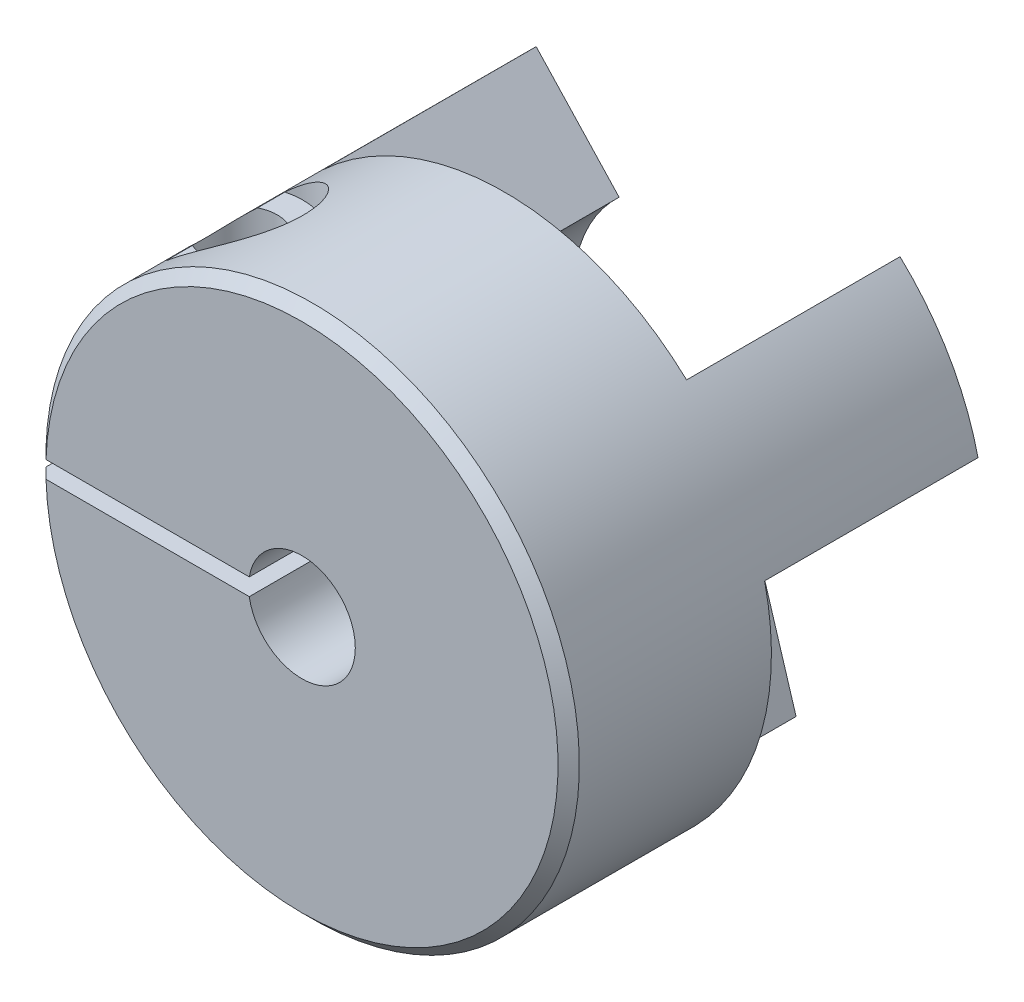
ISO-10303-21;
HEADER;
FILE_DESCRIPTION(('STEP AP214'),'2;1');
FILE_NAME('part.step','',(''),(''),'','','');
FILE_SCHEMA(('AUTOMOTIVE_DESIGN { 1 0 10303 214 1 1 1 1 }'));
ENDSEC;
DATA;
#1=APPLICATION_CONTEXT('core data for automotive mechanical design processes');
#2=APPLICATION_PROTOCOL_DEFINITION('international standard','automotive_design',2000,#1);
#3=PRODUCT_CONTEXT('',#1,'mechanical');
#4=PRODUCT('Part','Part','',(#3));
#5=PRODUCT_RELATED_PRODUCT_CATEGORY('part','',(#4));
#6=PRODUCT_DEFINITION_FORMATION('','',#4);
#7=PRODUCT_DEFINITION_CONTEXT('part definition',#1,'design');
#8=PRODUCT_DEFINITION('design','',#6,#7);
#9=PRODUCT_DEFINITION_SHAPE('','',#8);
#10=(LENGTH_UNIT() NAMED_UNIT(*) SI_UNIT(.MILLI.,.METRE.));
#11=(NAMED_UNIT(*) PLANE_ANGLE_UNIT() SI_UNIT($,.RADIAN.));
#12=(NAMED_UNIT(*) SI_UNIT($,.STERADIAN.) SOLID_ANGLE_UNIT());
#13=UNCERTAINTY_MEASURE_WITH_UNIT(LENGTH_MEASURE(1.E-05),#10,'distance_accuracy_value','');
#14=(GEOMETRIC_REPRESENTATION_CONTEXT(3) GLOBAL_UNCERTAINTY_ASSIGNED_CONTEXT((#13)) GLOBAL_UNIT_ASSIGNED_CONTEXT((#10,
#11,#12)) REPRESENTATION_CONTEXT('',''));
#15=CARTESIAN_POINT('',(0.,0.,0.));
#16=DIRECTION('',(0.,0.,1.));
#17=DIRECTION('',(1.,0.,0.));
#18=AXIS2_PLACEMENT_3D('',#15,#16,#17);
#19=CARTESIAN_POINT('',(0.,0.,30.));
#20=DIRECTION('',(0.,0.,-1.));
#21=DIRECTION('',(-1.,0.,0.));
#22=AXIS2_PLACEMENT_3D('',#19,#20,#21);
#23=CYLINDRICAL_SURFACE('',#22,12.5);
#24=CARTESIAN_POINT('',(-7.6,-9.92421281513048,26.5));
#25=CARTESIAN_POINT('',(-7.68387893240252,-9.85997501388689,26.4999990668987));
#26=CARTESIAN_POINT('',(-7.76703857513674,-9.79458974366175,26.4915589530429));
#27=CARTESIAN_POINT('',(-7.92994925789858,-9.66317408930223,26.4585437537323));
#28=CARTESIAN_POINT('',(-8.00968671612452,-9.59714222024347,26.4339097579805));
#29=CARTESIAN_POINT('',(-8.1691972059026,-9.46181273338649,26.3664863933876));
#30=CARTESIAN_POINT('',(-8.2485698895975,-9.39261661070717,26.3225309830227));
#31=CARTESIAN_POINT('',(-8.39834638585054,-9.25892967544829,26.2162022999162));
#32=CARTESIAN_POINT('',(-8.46877481949099,-9.19442616439073,26.1538812276331));
#33=CARTESIAN_POINT('',(-8.57222927758574,-9.09779263904373,26.0378881768289));
#34=CARTESIAN_POINT('',(-8.60921173738582,-9.06276421607423,25.990133738076));
#35=CARTESIAN_POINT('',(-8.67706529521363,-8.99781790078996,25.8873451831582));
#36=CARTESIAN_POINT('',(-8.70794626351018,-8.9678917655327,25.8323230684441));
#37=CARTESIAN_POINT('',(-8.75671836935872,-8.9202478067014,25.726661162025));
#38=CARTESIAN_POINT('',(-8.77596550900409,-8.90128896328587,25.6772135383242));
#39=CARTESIAN_POINT('',(-8.80833596594029,-8.86925806359337,25.5745221109184));
#40=CARTESIAN_POINT('',(-8.8214635914766,-8.85618186605753,25.5212810084248));
#41=CARTESIAN_POINT('',(-8.84072211978142,-8.83695793454696,25.411895186045));
#42=CARTESIAN_POINT('',(-8.84680333239945,-8.83085940971742,25.3557327286654));
#43=CARTESIAN_POINT('',(-8.85125405531002,-8.82639872111681,25.2428030069807));
#44=CARTESIAN_POINT('',(-8.84962689745147,-8.8280332148426,25.1860360145629));
#45=CARTESIAN_POINT('',(-8.83943558165185,-8.83823609156327,25.0802847985366));
#46=CARTESIAN_POINT('',(-8.83166855849576,-8.84600759611886,25.0311408411908));
#47=CARTESIAN_POINT('',(-8.81071211495501,-8.86688048496426,24.9352144751942));
#48=CARTESIAN_POINT('',(-8.79752056447862,-8.8799839629808,24.8884330023505));
#49=CARTESIAN_POINT('',(-8.76155296266749,-8.91549242952821,24.7839233398334));
#50=CARTESIAN_POINT('',(-8.73707041699478,-8.93952415080396,24.7273370269448));
#51=CARTESIAN_POINT('',(-8.68159285234098,-8.99341118960891,24.6204766352985));
#52=CARTESIAN_POINT('',(-8.65058500164624,-9.02327797310853,24.5702153102265));
#53=CARTESIAN_POINT('',(-8.57172361060947,-9.09832059660089,24.4598620356182));
#54=CARTESIAN_POINT('',(-8.52176454833326,-9.14520514731759,24.402444378267));
#55=CARTESIAN_POINT('',(-8.41494840468984,-9.24358911413135,24.2992708445779));
#56=CARTESIAN_POINT('',(-8.35808445202518,-9.29509311366319,24.2535267276955));
#57=CARTESIAN_POINT('',(-8.23759752658586,-9.40205489200958,24.1723288992536));
#58=CARTESIAN_POINT('',(-8.17383965010894,-9.45757983770614,24.1371657861184));
#59=CARTESIAN_POINT('',(-8.04214562035359,-9.56981677126619,24.0785894960378));
#60=CARTESIAN_POINT('',(-7.97420872623943,-9.62652896841746,24.0551784092115));
#61=CARTESIAN_POINT('',(-7.82030510738814,-9.75216283659322,24.0164905871854));
#62=CARTESIAN_POINT('',(-7.73360727189793,-9.82108266942204,24.0040529057531));
#63=CARTESIAN_POINT('',(-7.55791038521023,-9.95692248131038,23.9976227510883));
#64=CARTESIAN_POINT('',(-7.4689113367745,-10.0238424627698,24.00363025572));
#65=CARTESIAN_POINT('',(-7.30602525112332,-10.1430007304761,24.0327262090234));
#66=CARTESIAN_POINT('',(-7.23205410468351,-10.1958466549922,24.0528510715271));
#67=CARTESIAN_POINT('',(-7.08670423561914,-10.2974000295699,24.1076162450596));
#68=CARTESIAN_POINT('',(-7.01532213947848,-10.3461129845503,24.1422368714474));
#69=CARTESIAN_POINT('',(-6.88932801153551,-10.4303372039459,24.2194821232642));
#70=CARTESIAN_POINT('',(-6.83389513325901,-10.4666993327386,24.2598354504168));
#71=CARTESIAN_POINT('',(-6.72880105556181,-10.5345690120851,24.3509223120323));
#72=CARTESIAN_POINT('',(-6.67913893435736,-10.5660773382168,24.4016541851091));
#73=CARTESIAN_POINT('',(-6.58758134943983,-10.6234043259133,24.5132812183037));
#74=CARTESIAN_POINT('',(-6.54574469359811,-10.6491801614728,24.5742472725999));
#75=CARTESIAN_POINT('',(-6.47278621450771,-10.6936840567788,24.7046087444252));
#76=CARTESIAN_POINT('',(-6.44165534454685,-10.7124180683306,24.7739969775336));
#77=CARTESIAN_POINT('',(-6.39551565087219,-10.7400189546131,24.9092174403513));
#78=CARTESIAN_POINT('',(-6.37892219609344,-10.7498612132183,24.9743120097952));
#79=CARTESIAN_POINT('',(-6.35639684850603,-10.7631964230495,25.1069424832717));
#80=CARTESIAN_POINT('',(-6.35045806726809,-10.766693476576,25.1744767811419));
#81=CARTESIAN_POINT('',(-6.34963134292491,-10.7671805366923,25.303557625438));
#82=CARTESIAN_POINT('',(-6.35380145736474,-10.7647251846686,25.3650988256944));
#83=CARTESIAN_POINT('',(-6.3710407633935,-10.7545310867164,25.486460512705));
#84=CARTESIAN_POINT('',(-6.38410862181534,-10.7467931322904,25.5462812558397));
#85=CARTESIAN_POINT('',(-6.41837800448828,-10.7263607177177,25.662188754854));
#86=CARTESIAN_POINT('',(-6.43952488060037,-10.7136995491784,25.7182976897356));
#87=CARTESIAN_POINT('',(-6.4890014412295,-10.6838051452944,25.8259280188613));
#88=CARTESIAN_POINT('',(-6.51733264849404,-10.6665709406405,25.8774484374191));
#89=CARTESIAN_POINT('',(-6.58210298326866,-10.6267329662093,25.9781487610848));
#90=CARTESIAN_POINT('',(-6.61895182448738,-10.6038512924259,26.0269539280707));
#91=CARTESIAN_POINT('',(-6.69808250767865,-10.5540454980953,26.1175643286869));
#92=CARTESIAN_POINT('',(-6.74036604265006,-10.527120117423,26.1593673716514));
#93=CARTESIAN_POINT('',(-6.83446922820905,-10.4663047527811,26.2403408484846));
#94=CARTESIAN_POINT('',(-6.88682190212647,-10.4319653960025,26.2785519148117));
#95=CARTESIAN_POINT('',(-6.99496672289602,-10.3597623961685,26.3456700091722));
#96=CARTESIAN_POINT('',(-7.05076203916674,-10.3218954886719,26.3745683065464));
#97=CARTESIAN_POINT('',(-7.17368153568159,-10.2369306446989,26.4272556186633));
#98=CARTESIAN_POINT('',(-7.24115822111427,-10.1893394698823,26.4494195481482));
#99=CARTESIAN_POINT('',(-7.37688803993087,-10.0915067533404,26.4819031068614));
#100=CARTESIAN_POINT('',(-7.44514019786839,-10.0412683026013,26.4922362427807));
#101=CARTESIAN_POINT('',(-7.54210522411499,-9.96834924724743,26.498998497446));
#102=CARTESIAN_POINT('',(-7.57109531958037,-9.94634916167928,26.5000003215467));
#103=CARTESIAN_POINT('',(-7.6,-9.92421281513048,26.5));
#104=B_SPLINE_CURVE_WITH_KNOTS('',3,(#24,#25,#26,#27,#28,#29,#30,#31,#32,#33,#34,#35,#36,#37,
#38,#39,#40,#41,#42,#43,#44,#45,#46,#47,#48,#49,#50,#51,#52,#53,#54,#55,#56,#57,#58,#59,#60,#61,
#62,#63,#64,#65,#66,#67,#68,#69,#70,#71,#72,#73,#74,#75,#76,#77,#78,#79,#80,#81,#82,#83,#84,#85,
#86,#87,#88,#89,#90,#91,#92,#93,#94,#95,#96,#97,#98,#99,#100,#101,#102,#103),.UNSPECIFIED.,.T.,
.F.,(4,2,2,2,2,2,2,2,2,2,2,2,2,2,2,2,2,2,2,2,2,2,2,2,2,2,2,2,2,2,2,2,2,2,2,2,2,2,2,4),(0.,
0.316865241311505,0.634889605397307,0.975519522756832,1.31519045989525,1.52400263789751,
1.73247420778647,1.90085408598353,2.06911524208715,2.23855586275837,2.40792325147661,
2.55832660266192,2.70878907039603,2.9062234974507,3.10404986018343,3.37078662412628,
3.637791036622,3.91157121918875,4.18540007682069,4.51822228774219,4.85104409924995,
5.12927031980454,5.40711993990698,5.63900873717533,5.87086044294774,6.10439004745895,
6.33772182468545,6.5402849302682,6.74271702806967,6.92702205736014,7.11129947792808,
7.294351866951,7.47744308713101,7.67253481749374,7.8676874701945,8.08689097869655,
8.30629939521027,8.56183970699069,8.81708798794211,8.92627975128317),.UNSPECIFIED.);
#105=CARTESIAN_POINT('',(-7.6,-9.92421281513048,26.5));
#106=VERTEX_POINT('',#105);
#107=EDGE_CURVE('E236',#106,#106,#104,.T.);
#108=ORIENTED_EDGE('',*,*,#107,.F.);
#109=EDGE_LOOP('',(#108));
#110=FACE_BOUND('',#109,.T.);
#111=CARTESIAN_POINT('',(-8.35224520712844,9.3,23.7254911780012));
#112=CARTESIAN_POINT('',(-8.40226193404916,9.25508729611474,23.7501859675804));
#113=CARTESIAN_POINT('',(-8.4512364555864,9.21036807082561,23.7773995701309));
#114=CARTESIAN_POINT('',(-8.54687845049452,9.12168281106277,23.8369838824607));
#115=CARTESIAN_POINT('',(-8.59354117082,9.07771844065415,23.8693646826729));
#116=CARTESIAN_POINT('',(-8.68467769234288,8.99057294568326,23.9397234366466));
#117=CARTESIAN_POINT('',(-8.72911868921365,8.94740744980079,23.9777636277927));
#118=CARTESIAN_POINT('',(-8.81473334070862,8.86307418206008,24.0592386730297));
#119=CARTESIAN_POINT('',(-8.85590993986654,8.8219046231677,24.1026685726654));
#120=CARTESIAN_POINT('',(-8.94579144857408,8.73086376515911,24.2083922940015));
#121=CARTESIAN_POINT('',(-8.99327100113298,8.68188088533853,24.272524924123));
#122=CARTESIAN_POINT('',(-9.08026131183957,8.59085571876297,24.4101109852827));
#123=CARTESIAN_POINT('',(-9.11980294161462,8.54878666381892,24.4835264228847));
#124=CARTESIAN_POINT('',(-9.18170707878571,8.48220967442307,24.6232926843491));
#125=CARTESIAN_POINT('',(-9.20593227999762,8.45586909085604,24.6879313099214));
#126=CARTESIAN_POINT('',(-9.24679495439347,8.41116555145942,24.8222376178885));
#127=CARTESIAN_POINT('',(-9.2634362704352,8.39279855552864,24.8919027325171));
#128=CARTESIAN_POINT('',(-9.28795731971447,8.36565591053207,25.0352437135378));
#129=CARTESIAN_POINT('',(-9.29576480665469,8.35695935970522,25.1089475555037));
#130=CARTESIAN_POINT('',(-9.30159980379011,8.35046502407868,25.2572103254579));
#131=CARTESIAN_POINT('',(-9.29963247784537,8.35266148469334,25.3317687812023));
#132=CARTESIAN_POINT('',(-9.28700971237624,8.36669071447892,25.4694607688084));
#133=CARTESIAN_POINT('',(-9.27749463970581,8.37725842575372,25.5328383996841));
#134=CARTESIAN_POINT('',(-9.25187706516665,8.40554182397002,25.6565700820806));
#135=CARTESIAN_POINT('',(-9.23577188613165,8.42326041584669,25.7169228936003));
#136=CARTESIAN_POINT('',(-9.19103679871523,8.47208852541456,25.8546138617646));
#137=CARTESIAN_POINT('',(-9.15998597138285,8.50572192948052,25.930266124301));
#138=CARTESIAN_POINT('',(-9.08951065341228,8.58099434314065,26.0732532355516));
#139=CARTESIAN_POINT('',(-9.05006654390278,8.62265208722077,26.1405680022186));
#140=CARTESIAN_POINT('',(-8.9472728065756,8.72947666786682,26.2922655802687));
#141=CARTESIAN_POINT('',(-8.88070472255737,8.79734010286694,26.3725501817322));
#142=CARTESIAN_POINT('',(-8.73779282300051,8.93930400730743,26.5171924062114));
#143=CARTESIAN_POINT('',(-8.66144048840268,9.01340989249439,26.5815360046045));
#144=CARTESIAN_POINT('',(-8.54454616953303,9.1237768200878,26.6641613940842));
#145=CARTESIAN_POINT('',(-8.50699903790586,9.15880320147978,26.6885197100563));
#146=CARTESIAN_POINT('',(-8.43060123949417,9.2291737642549,26.7339356510727));
#147=CARTESIAN_POINT('',(-8.39175696958336,9.26451589430551,26.7550072035281));
#148=CARTESIAN_POINT('',(-8.35224520712907,9.29999999999944,26.7745088220005));
#149=B_SPLINE_CURVE_WITH_KNOTS('',3,(#111,#112,#113,#114,#115,#116,#117,#118,#119,#120,#121,
#122,#123,#124,#125,#126,#127,#128,#129,#130,#131,#132,#133,#134,#135,#136,#137,#138,#139,#140,
#141,#142,#143,#144,#145,#146,#147,#148),.UNSPECIFIED.,.F.,.F.,(4,2,2,2,2,2,2,2,2,2,2,2,2,2,2,2,
2,2,4),(0.,0.214819906168286,0.430064562217868,0.647880296760304,0.86549726843017,
1.14549332214258,1.42437838773678,1.64519134608746,1.86589229076014,2.08838544952107,
2.31076108159869,2.50476806710598,2.69885394442305,2.96265569184933,3.22708097229084,
3.59838260309518,3.97000974788138,4.14041701421656,4.31008133574808),.UNSPECIFIED.);
#150=CARTESIAN_POINT('',(-8.35224520712844,9.3,23.7254911780011));
#151=VERTEX_POINT('',#150);
#152=CARTESIAN_POINT('',(-8.35224520712844,9.3,26.7745088219989));
#153=VERTEX_POINT('',#152);
#154=EDGE_CURVE('E193',#151,#153,#149,.T.);
#155=ORIENTED_EDGE('',*,*,#154,.F.);
#156=DIRECTION('',(0.,0.,-1.));
#157=VECTOR('',#156,1.);
#158=CARTESIAN_POINT('',(-8.35224520712844,9.3,30.));
#159=LINE('',#158,#157);
#160=CARTESIAN_POINT('',(-8.35224520712844,9.3,22.4492631061893));
#161=VERTEX_POINT('',#160);
#162=EDGE_CURVE('E176',#161,#151,#159,.F.);
#163=ORIENTED_EDGE('',*,*,#162,.F.);
#164=CARTESIAN_POINT('',(-8.35224520712844,9.3,28.0507368938107));
#165=CARTESIAN_POINT('',(-8.26293950720659,9.38022098917911,28.0747136471542));
#166=CARTESIAN_POINT('',(-8.17182825992512,9.45970676843527,28.0946133193194));
#167=CARTESIAN_POINT('',(-7.98635106699914,9.61680341182153,28.1256919557303));
#168=CARTESIAN_POINT('',(-7.89198098158537,9.69441166096315,28.1368593672165));
#169=CARTESIAN_POINT('',(-7.69997510730801,9.84761755883427,28.149881570101));
#170=CARTESIAN_POINT('',(-7.60232242673459,9.92319936917805,28.1516769600697));
#171=CARTESIAN_POINT('',(-7.4051000657056,10.071231608398,28.145125081026));
#172=CARTESIAN_POINT('',(-7.30553147667928,10.1436837480198,28.1367834276922));
#173=CARTESIAN_POINT('',(-7.04511871236953,10.3273724804234,28.1010100047947));
#174=CARTESIAN_POINT('',(-6.88334106018227,10.4358075798013,28.0651291613088));
#175=CARTESIAN_POINT('',(-6.56206180609799,10.6407467476791,27.9631064915147));
#176=CARTESIAN_POINT('',(-6.40255564706173,10.7372790277478,27.8970380362465));
#177=CARTESIAN_POINT('',(-6.16914680392402,10.8719776066146,27.7739899126952));
#178=CARTESIAN_POINT('',(-6.09195929284978,10.9153792104769,27.7287043103893));
#179=CARTESIAN_POINT('',(-5.94074821983299,10.9984052628958,27.6301287094269));
#180=CARTESIAN_POINT('',(-5.86672309111758,11.0380315941332,27.5768427349698));
#181=CARTESIAN_POINT('',(-5.72282615105309,11.113319343656,27.4623912673127));
#182=CARTESIAN_POINT('',(-5.65295538959969,11.1489797616374,27.4012237945584));
#183=CARTESIAN_POINT('',(-5.51843665048896,11.2161716997034,27.2713435095178));
#184=CARTESIAN_POINT('',(-5.45378779662154,11.2477039130337,27.2026319676728));
#185=CARTESIAN_POINT('',(-5.33890274715841,11.3026377939579,27.0677500663984));
#186=CARTESIAN_POINT('',(-5.28789206320964,11.3265631549328,27.0024504532011));
#187=CARTESIAN_POINT('',(-5.19118617234646,11.3712102894973,26.8669556806136));
#188=CARTESIAN_POINT('',(-5.1454928203844,11.3919309459497,26.7967588263979));
#189=CARTESIAN_POINT('',(-5.06007099171543,11.4301300337332,26.6520726673792));
#190=CARTESIAN_POINT('',(-5.02033701900852,11.4476114559757,26.5775874063822));
#191=CARTESIAN_POINT('',(-4.94729161650502,11.479367834436,26.4248693692089));
#192=CARTESIAN_POINT('',(-4.91398239760068,11.4936416871399,26.3466353145151));
#193=CARTESIAN_POINT('',(-4.82973798584549,11.5294048576894,26.1215705682794));
#194=CARTESIAN_POINT('',(-4.78673048223669,11.5472201781899,25.9710691877698));
#195=CARTESIAN_POINT('',(-4.7254939120127,11.5724162187856,25.6643640526813));
#196=CARTESIAN_POINT('',(-4.70725886329544,11.579799458058,25.5081616841476));
#197=CARTESIAN_POINT('',(-4.69646410379634,11.584181089387,25.1996787237852));
#198=CARTESIAN_POINT('',(-4.70311006258827,11.5815007547541,25.0474304724457));
#199=CARTESIAN_POINT('',(-4.74004751066886,11.5664316602643,24.7463363694815));
#200=CARTESIAN_POINT('',(-4.77033723588752,11.5540436247022,24.5974902648742));
#201=CARTESIAN_POINT('',(-4.85318126093607,11.5194886557954,24.3078767692581));
#202=CARTESIAN_POINT('',(-4.9056613324079,11.4973543144486,24.1670842051032));
#203=CARTESIAN_POINT('',(-5.03073999476451,11.4431759480608,23.8968269189766));
#204=CARTESIAN_POINT('',(-5.10333839448021,11.4111320171827,23.7673620893815));
#205=CARTESIAN_POINT('',(-5.26729102301348,11.3363963570979,23.5206000125109));
#206=CARTESIAN_POINT('',(-5.35897435706196,11.2935145050267,23.4035795681062));
#207=CARTESIAN_POINT('',(-5.55655600955504,11.1976214564941,23.1870317367122));
#208=CARTESIAN_POINT('',(-5.66245753734436,11.1446079719631,23.0875083109148));
#209=CARTESIAN_POINT('',(-5.89061287109652,11.0257913673905,22.9025066283258));
#210=CARTESIAN_POINT('',(-6.01344333789608,10.9594486526414,22.8180895239203));
#211=CARTESIAN_POINT('',(-6.26606232950751,10.8170005662463,22.6708514205152));
#212=CARTESIAN_POINT('',(-6.39585110593982,10.7408948414201,22.6080312030934));
#213=CARTESIAN_POINT('',(-6.67276520912226,10.5713444274491,22.4977644186962));
#214=CARTESIAN_POINT('',(-6.82024115776802,10.4769142114719,22.4527320778459));
#215=CARTESIAN_POINT('',(-7.11489576532022,10.2790959802123,22.3868685073896));
#216=CARTESIAN_POINT('',(-7.2620733494475,10.1756915122637,22.3660827813864));
#217=CARTESIAN_POINT('',(-7.48965300002123,10.0082768290894,22.3509239202925));
#218=CARTESIAN_POINT('',(-7.57137554044642,9.94659539778096,22.3490113465646));
#219=CARTESIAN_POINT('',(-7.73323519825306,9.82127980746248,22.3519321273997));
#220=CARTESIAN_POINT('',(-7.81337190419432,9.75764515234132,22.3567672099416));
#221=CARTESIAN_POINT('',(-7.9713003078811,9.62905449971884,22.3727771327598));
#222=CARTESIAN_POINT('',(-8.04910108071308,9.56410590763545,22.3839227723684));
#223=CARTESIAN_POINT('',(-8.20242836637512,9.43294098359872,22.4121938275297));
#224=CARTESIAN_POINT('',(-8.27795637252234,9.36672553298877,22.4293152192307));
#225=CARTESIAN_POINT('',(-8.35224520712844,9.3,22.4492631061893));
#226=B_SPLINE_CURVE_WITH_KNOTS('',3,(#164,#165,#166,#167,#168,#169,#170,#171,#172,#173,#174,
#175,#176,#177,#178,#179,#180,#181,#182,#183,#184,#185,#186,#187,#188,#189,#190,#191,#192,#193,
#194,#195,#196,#197,#198,#199,#200,#201,#202,#203,#204,#205,#206,#207,#208,#209,#210,#211,#212,
#213,#214,#215,#216,#217,#218,#219,#220,#221,#222,#223,#224,#225),.UNSPECIFIED.,.F.,.F.,(4,2,2,
2,2,2,2,2,2,2,2,2,2,2,2,2,2,2,2,2,2,2,2,2,2,2,2,2,2,2,4),(0.,0.367219716919647,
0.734924446481322,1.10495694451256,1.47478454683621,2.06642724331464,2.65663953829989,
2.95464862561599,3.25250831300957,3.55044295860737,3.84832750795231,4.10672076453523,
4.36520389313862,4.62344715176514,4.88177911937114,5.35183063451637,5.82176862049042,
6.27683359740196,6.73186462499502,7.18538543356048,7.63890193281229,8.10100555781767,
8.56321366522613,9.05061362252985,9.53803121667803,10.0784453082885,10.6198719711986,
10.9268684993671,11.2339436594221,11.5396093775088,11.8450696673796),.UNSPECIFIED.);
#227=CARTESIAN_POINT('',(-8.35224520712844,9.3,28.0507368938107));
#228=VERTEX_POINT('',#227);
#229=EDGE_CURVE('E255',#228,#161,#226,.T.);
#230=ORIENTED_EDGE('',*,*,#229,.F.);
#231=EDGE_CURVE('E187',#153,#228,#159,.F.);
#232=ORIENTED_EDGE('',*,*,#231,.F.);
#233=EDGE_LOOP('',(#155,#163,#230,#232));
#234=FACE_BOUND('',#233,.T.);
#235=DIRECTION('',(0.,0.,-1.));
#236=VECTOR('',#235,1.);
#237=CARTESIAN_POINT('',(-12.49359836076,0.4,30.));
#238=LINE('',#237,#236);
#239=CARTESIAN_POINT('',(-12.49359836076,0.4,29.4999999999998));
#240=VERTEX_POINT('',#239);
#241=CARTESIAN_POINT('',(-12.49359836076,0.4,20.5));
#242=VERTEX_POINT('',#241);
#243=EDGE_CURVE('E349',#240,#242,#238,.T.);
#244=ORIENTED_EDGE('',*,*,#243,.F.);
#245=CARTESIAN_POINT('',(0.,0.,29.4999999999998));
#246=DIRECTION('',(0.,0.,1.));
#247=DIRECTION('',(1.,0.,0.));
#248=AXIS2_PLACEMENT_3D('',#245,#246,#247);
#249=CIRCLE('',#248,12.5);
#250=CARTESIAN_POINT('',(-12.49359836076,-0.4,29.4999999999998));
#251=VERTEX_POINT('',#250);
#252=EDGE_CURVE('E189',#240,#251,#249,.F.);
#253=ORIENTED_EDGE('',*,*,#252,.T.);
#254=DIRECTION('',(0.,0.,-1.));
#255=VECTOR('',#254,1.);
#256=CARTESIAN_POINT('',(-12.49359836076,-0.4,30.));
#257=LINE('',#256,#255);
#258=CARTESIAN_POINT('',(-12.49359836076,-0.4,20.5));
#259=VERTEX_POINT('',#258);
#260=EDGE_CURVE('E342',#251,#259,#257,.T.);
#261=ORIENTED_EDGE('',*,*,#260,.T.);
#262=CARTESIAN_POINT('',(-1.86374595153507E-12,-5.56054525786042E-13,20.5));
#263=DIRECTION('',(0.,0.,-1.));
#264=DIRECTION('',(-1.,0.,0.));
#265=AXIS2_PLACEMENT_3D('',#262,#263,#264);
#266=CIRCLE('',#265,12.4999999999924);
#267=CARTESIAN_POINT('',(-3.65464630903773,-11.95380944953,20.5));
#268=VERTEX_POINT('',#267);
#269=EDGE_CURVE('E292',#268,#259,#266,.T.);
#270=ORIENTED_EDGE('',*,*,#269,.F.);
#271=DIRECTION('',(0.,0.,-1.));
#272=VECTOR('',#271,1.);
#273=CARTESIAN_POINT('',(-3.65464630903773,-11.95380944953,20.5));
#274=LINE('',#273,#272);
#275=CARTESIAN_POINT('',(-3.65464630903773,-11.95380944953,10.5));
#276=VERTEX_POINT('',#275);
#277=EDGE_CURVE('E263',#268,#276,#274,.T.);
#278=ORIENTED_EDGE('',*,*,#277,.T.);
#279=CARTESIAN_POINT('',(0.,0.,10.5));
#280=DIRECTION('',(0.,0.,-1.));
#281=DIRECTION('',(-1.,0.,0.));
#282=AXIS2_PLACEMENT_3D('',#279,#280,#281);
#283=CIRCLE('',#282,12.5);
#284=CARTESIAN_POINT('',(3.654646309034,-11.95380944953,10.5));
#285=VERTEX_POINT('',#284);
#286=EDGE_CURVE('E257',#285,#276,#283,.T.);
#287=ORIENTED_EDGE('',*,*,#286,.F.);
#288=DIRECTION('',(0.,0.,-1.));
#289=VECTOR('',#288,1.);
#290=CARTESIAN_POINT('',(3.654646309034,-11.95380944953,20.5));
#291=LINE('',#290,#289);
#292=CARTESIAN_POINT('',(3.654646309034,-11.95380944953,20.5));
#293=VERTEX_POINT('',#292);
#294=EDGE_CURVE('E262',#293,#285,#291,.T.);
#295=ORIENTED_EDGE('',*,*,#294,.F.);
#296=CARTESIAN_POINT('',(12.1796258098153,2.81188817929807,20.5));
#297=VERTEX_POINT('',#296);
#298=EDGE_CURVE('E277',#297,#293,#266,.T.);
#299=ORIENTED_EDGE('',*,*,#298,.F.);
#300=DIRECTION('',(0.,0.,1.));
#301=VECTOR('',#300,1.);
#302=CARTESIAN_POINT('',(12.1796258098153,2.81188817929807,10.5));
#303=LINE('',#302,#301);
#304=CARTESIAN_POINT('',(12.1796258098153,2.81188817929807,10.5));
#305=VERTEX_POINT('',#304);
#306=EDGE_CURVE('E299',#305,#297,#303,.T.);
#307=ORIENTED_EDGE('',*,*,#306,.F.);
#308=CARTESIAN_POINT('',(1.22159606229683E-13,-5.42005025016374E-13,10.5));
#309=DIRECTION('',(0.,0.,-1.));
#310=DIRECTION('',(1.,0.,0.));
#311=AXIS2_PLACEMENT_3D('',#308,#309,#310);
#312=CIRCLE('',#311,12.4999999999998);
#313=CARTESIAN_POINT('',(8.52497950078014,9.14192127023996,10.5));
#314=VERTEX_POINT('',#313);
#315=EDGE_CURVE('E316',#314,#305,#312,.T.);
#316=ORIENTED_EDGE('',*,*,#315,.F.);
#317=DIRECTION('',(0.,0.,1.));
#318=VECTOR('',#317,1.);
#319=CARTESIAN_POINT('',(8.52497950078014,9.14192127023996,10.5));
#320=LINE('',#319,#318);
#321=CARTESIAN_POINT('',(8.52497950078014,9.14192127023996,20.5));
#322=VERTEX_POINT('',#321);
#323=EDGE_CURVE('E298',#314,#322,#320,.T.);
#324=ORIENTED_EDGE('',*,*,#323,.T.);
#325=CARTESIAN_POINT('',(-8.52497950077913,9.141921270238,20.5));
#326=VERTEX_POINT('',#325);
#327=EDGE_CURVE('E390',#326,#322,#266,.T.);
#328=ORIENTED_EDGE('',*,*,#327,.F.);
#329=DIRECTION('',(0.,0.,1.));
#330=VECTOR('',#329,1.);
#331=CARTESIAN_POINT('',(-8.52497950077913,9.141921270238,10.5));
#332=LINE('',#331,#330);
#333=CARTESIAN_POINT('',(-8.52497950077913,9.141921270238,10.5));
#334=VERTEX_POINT('',#333);
#335=EDGE_CURVE('E326',#334,#326,#332,.T.);
#336=ORIENTED_EDGE('',*,*,#335,.F.);
#337=CARTESIAN_POINT('',(-7.61343185355269E-13,-7.33147911058031E-13,10.5));
#338=DIRECTION('',(0.,0.,-1.));
#339=DIRECTION('',(1.,0.,0.));
#340=AXIS2_PLACEMENT_3D('',#337,#338,#339);
#341=CIRCLE('',#340,12.4999999999974);
#342=CARTESIAN_POINT('',(-12.179625809813,2.81188817929974,10.5));
#343=VERTEX_POINT('',#342);
#344=EDGE_CURVE('E345',#343,#334,#341,.T.);
#345=ORIENTED_EDGE('',*,*,#344,.F.);
#346=DIRECTION('',(0.,0.,1.));
#347=VECTOR('',#346,1.);
#348=CARTESIAN_POINT('',(-12.179625809813,2.81188817929974,10.5));
#349=LINE('',#348,#347);
#350=CARTESIAN_POINT('',(-12.179625809813,2.81188817929974,20.5));
#351=VERTEX_POINT('',#350);
#352=EDGE_CURVE('E323',#343,#351,#349,.T.);
#353=ORIENTED_EDGE('',*,*,#352,.T.);
#354=EDGE_CURVE('E294',#242,#351,#266,.T.);
#355=ORIENTED_EDGE('',*,*,#354,.F.);
#356=EDGE_LOOP('',(#244,#253,#261,#270,#278,#287,#295,#299,#307,#316,#324,#328,#336,#345,#353,#355));
#357=FACE_BOUND('',#356,.T.);
#358=ADVANCED_FACE('F41',(#110,#234,#357),#23,.T.);
#359=CARTESIAN_POINT('',(-1.86374595153507E-12,-5.56054525786042E-13,20.5));
#360=DIRECTION('',(0.,0.,-1.));
#361=DIRECTION('',(-1.,0.,0.));
#362=AXIS2_PLACEMENT_3D('',#359,#360,#361);
#363=PLANE('',#362);
#364=CARTESIAN_POINT('',(0.,0.,20.5));
#365=DIRECTION('',(0.,0.,-1.));
#366=DIRECTION('',(-1.,0.,0.));
#367=AXIS2_PLACEMENT_3D('',#364,#365,#366);
#368=CIRCLE('',#367,2.50000000000038);
#369=CARTESIAN_POINT('',(-2.467792535851,0.4,20.5));
#370=VERTEX_POINT('',#369);
#371=CARTESIAN_POINT('',(-2.467792535851,-0.4,20.5));
#372=VERTEX_POINT('',#371);
#373=EDGE_CURVE('E200',#370,#372,#368,.T.);
#374=ORIENTED_EDGE('',*,*,#373,.F.);
#375=DIRECTION('',(1.,0.,0.));
#376=VECTOR('',#375,1.);
#377=CARTESIAN_POINT('',(-12.49359836076,0.4,20.5));
#378=LINE('',#377,#376);
#379=EDGE_CURVE('E362',#242,#370,#378,.T.);
#380=ORIENTED_EDGE('',*,*,#379,.F.);
#381=ORIENTED_EDGE('',*,*,#354,.T.);
#382=DIRECTION('',(-0.974370064785185,0.224951054344084,0.));
#383=VECTOR('',#382,1.);
#384=CARTESIAN_POINT('',(-12.179625809813,2.81188817929974,20.5));
#385=LINE('',#384,#383);
#386=CARTESIAN_POINT('',(-6.62571644054007,1.52966716953905,20.5));
#387=VERTEX_POINT('',#386);
#388=EDGE_CURVE('E333',#387,#351,#385,.T.);
#389=ORIENTED_EDGE('',*,*,#388,.F.);
#390=CARTESIAN_POINT('',(-7.61343185355269E-13,-7.33147911058031E-13,20.5));
#391=DIRECTION('',(0.,0.,1.));
#392=DIRECTION('',(-1.,0.,0.));
#393=AXIS2_PLACEMENT_3D('',#390,#391,#392);
#394=CIRCLE('',#393,6.80000000000005);
#395=CARTESIAN_POINT('',(-4.6375888484252,4.97320517101021,20.5));
#396=VERTEX_POINT('',#395);
#397=EDGE_CURVE('E336',#396,#387,#394,.T.);
#398=ORIENTED_EDGE('',*,*,#397,.F.);
#399=DIRECTION('',(0.681998360062412,-0.731353701619251,0.));
#400=VECTOR('',#399,1.);
#401=CARTESIAN_POINT('',(-4.6375888484252,4.97320517101021,20.5));
#402=LINE('',#401,#400);
#403=EDGE_CURVE('E332',#326,#396,#402,.T.);
#404=ORIENTED_EDGE('',*,*,#403,.F.);
#405=ORIENTED_EDGE('',*,*,#327,.T.);
#406=DIRECTION('',(0.681998360062412,0.731353701619251,0.));
#407=VECTOR('',#406,1.);
#408=CARTESIAN_POINT('',(8.52497950078014,9.14192127023996,20.5));
#409=LINE('',#408,#407);
#410=CARTESIAN_POINT('',(4.63758884842455,4.97320517101039,20.5));
#411=VERTEX_POINT('',#410);
#412=EDGE_CURVE('E306',#411,#322,#409,.T.);
#413=ORIENTED_EDGE('',*,*,#412,.F.);
#414=CARTESIAN_POINT('',(1.22159606229683E-13,-5.42005025016374E-13,20.5));
#415=DIRECTION('',(0.,0.,1.));
#416=DIRECTION('',(-1.,0.,0.));
#417=AXIS2_PLACEMENT_3D('',#414,#415,#416);
#418=CIRCLE('',#417,6.80000000000004);
#419=CARTESIAN_POINT('',(6.62571644053972,1.52966716953793,20.5));
#420=VERTEX_POINT('',#419);
#421=EDGE_CURVE('E313',#420,#411,#418,.T.);
#422=ORIENTED_EDGE('',*,*,#421,.F.);
#423=DIRECTION('',(-0.974370064785229,-0.224951054343892,0.));
#424=VECTOR('',#423,1.);
#425=CARTESIAN_POINT('',(6.62571644053972,1.52966716953793,20.5));
#426=LINE('',#425,#424);
#427=EDGE_CURVE('E301',#297,#420,#426,.T.);
#428=ORIENTED_EDGE('',*,*,#427,.F.);
#429=ORIENTED_EDGE('',*,*,#298,.T.);
#430=DIRECTION('',(-0.292371704723048,0.95630475596294,0.));
#431=VECTOR('',#430,1.);
#432=CARTESIAN_POINT('',(3.654646309034,-11.95380944953,20.5));
#433=LINE('',#432,#431);
#434=CARTESIAN_POINT('',(1.988127592115,-6.502872340549,20.5));
#435=VERTEX_POINT('',#434);
#436=EDGE_CURVE('E290',#293,#435,#433,.T.);
#437=ORIENTED_EDGE('',*,*,#436,.T.);
#438=CARTESIAN_POINT('',(-1.86374595153507E-12,-5.56054525786042E-13,20.5));
#439=DIRECTION('',(0.,0.,-1.));
#440=DIRECTION('',(-1.,0.,0.));
#441=AXIS2_PLACEMENT_3D('',#438,#439,#440);
#442=CIRCLE('',#441,6.80000000000047);
#443=CARTESIAN_POINT('',(-1.98812759211873,-6.502872340549,20.5));
#444=VERTEX_POINT('',#443);
#445=EDGE_CURVE('E282',#435,#444,#442,.T.);
#446=ORIENTED_EDGE('',*,*,#445,.T.);
#447=DIRECTION('',(-0.292371704723048,-0.95630475596294,0.));
#448=VECTOR('',#447,1.);
#449=CARTESIAN_POINT('',(-1.98812759211873,-6.502872340549,20.5));
#450=LINE('',#449,#448);
#451=EDGE_CURVE('E270',#444,#268,#450,.T.);
#452=ORIENTED_EDGE('',*,*,#451,.T.);
#453=ORIENTED_EDGE('',*,*,#269,.T.);
#454=DIRECTION('',(-1.,0.,0.));
#455=VECTOR('',#454,1.);
#456=CARTESIAN_POINT('',(-2.467792535851,-0.4,20.5));
#457=LINE('',#456,#455);
#458=EDGE_CURVE('E360',#372,#259,#457,.T.);
#459=ORIENTED_EDGE('',*,*,#458,.F.);
#460=EDGE_LOOP('',(#374,#380,#381,#389,#398,#404,#405,#413,#422,#428,#429,#437,#446,#452,#453,#459));
#461=FACE_BOUND('',#460,.T.);
#462=ADVANCED_FACE('F373',(#461),#363,.T.);
#463=CARTESIAN_POINT('',(12.5,0.,30.));
#464=DIRECTION('',(0.,0.,1.));
#465=DIRECTION('',(1.,0.,0.));
#466=AXIS2_PLACEMENT_3D('',#463,#464,#465);
#467=PLANE('',#466);
#468=DIRECTION('',(-1.,0.,0.));
#469=VECTOR('',#468,1.);
#470=CARTESIAN_POINT('',(-2.467792535851,-0.4,30.));
#471=LINE('',#470,#469);
#472=CARTESIAN_POINT('',(-2.467792535851,-0.4,30.));
#473=VERTEX_POINT('',#472);
#474=CARTESIAN_POINT('',(-11.9933314804522,-0.4,30.));
#475=VERTEX_POINT('',#474);
#476=EDGE_CURVE('E355',#473,#475,#471,.T.);
#477=ORIENTED_EDGE('',*,*,#476,.T.);
#478=CARTESIAN_POINT('',(0.,0.,30.));
#479=DIRECTION('',(0.,0.,1.));
#480=DIRECTION('',(1.,0.,0.));
#481=AXIS2_PLACEMENT_3D('',#478,#479,#480);
#482=CIRCLE('',#481,12.0000000000002);
#483=CARTESIAN_POINT('',(-11.9933314804522,0.4,30.));
#484=VERTEX_POINT('',#483);
#485=EDGE_CURVE('E57',#475,#484,#482,.T.);
#486=ORIENTED_EDGE('',*,*,#485,.T.);
#487=DIRECTION('',(1.,0.,0.));
#488=VECTOR('',#487,1.);
#489=CARTESIAN_POINT('',(-12.49359836076,0.4,30.));
#490=LINE('',#489,#488);
#491=CARTESIAN_POINT('',(-2.467792535851,0.4,30.));
#492=VERTEX_POINT('',#491);
#493=EDGE_CURVE('E363',#484,#492,#490,.T.);
#494=ORIENTED_EDGE('',*,*,#493,.T.);
#495=CARTESIAN_POINT('',(0.,0.,30.));
#496=DIRECTION('',(0.,0.,-1.));
#497=DIRECTION('',(-1.,0.,0.));
#498=AXIS2_PLACEMENT_3D('',#495,#496,#497);
#499=CIRCLE('',#498,2.50000000000038);
#500=EDGE_CURVE('E203',#492,#473,#499,.T.);
#501=ORIENTED_EDGE('',*,*,#500,.T.);
#502=EDGE_LOOP('',(#477,#486,#494,#501));
#503=FACE_BOUND('',#502,.T.);
#504=ADVANCED_FACE('F366',(#503),#467,.T.);
#505=CARTESIAN_POINT('',(0.,0.,10.5));
#506=DIRECTION('',(0.,0.,-1.));
#507=DIRECTION('',(-1.,0.,0.));
#508=AXIS2_PLACEMENT_3D('',#505,#506,#507);
#509=PLANE('',#508);
#510=DIRECTION('',(-0.292371704723048,0.95630475596294,0.));
#511=VECTOR('',#510,1.);
#512=CARTESIAN_POINT('',(3.654646309034,-11.95380944953,10.5));
#513=LINE('',#512,#511);
#514=CARTESIAN_POINT('',(1.988127592115,-6.502872340549,10.5));
#515=VERTEX_POINT('',#514);
#516=EDGE_CURVE('E278',#285,#515,#513,.T.);
#517=ORIENTED_EDGE('',*,*,#516,.F.);
#518=ORIENTED_EDGE('',*,*,#286,.T.);
#519=DIRECTION('',(-0.292371704723048,-0.95630475596294,0.));
#520=VECTOR('',#519,1.);
#521=CARTESIAN_POINT('',(-1.98812759211873,-6.502872340549,10.5));
#522=LINE('',#521,#520);
#523=CARTESIAN_POINT('',(-1.98812759211873,-6.502872340549,10.5));
#524=VERTEX_POINT('',#523);
#525=EDGE_CURVE('E273',#524,#276,#522,.T.);
#526=ORIENTED_EDGE('',*,*,#525,.F.);
#527=CARTESIAN_POINT('',(-1.86374595153507E-12,-5.56054525786042E-13,10.5));
#528=DIRECTION('',(0.,0.,-1.));
#529=DIRECTION('',(-1.,0.,0.));
#530=AXIS2_PLACEMENT_3D('',#527,#528,#529);
#531=CIRCLE('',#530,6.80000000000047);
#532=EDGE_CURVE('E280',#515,#524,#531,.T.);
#533=ORIENTED_EDGE('',*,*,#532,.F.);
#534=EDGE_LOOP('',(#517,#518,#526,#533));
#535=FACE_BOUND('',#534,.T.);
#536=ADVANCED_FACE('F401',(#535),#509,.T.);
#537=CARTESIAN_POINT('',(-1.98812759211873,-6.502872340549,20.5));
#538=DIRECTION('',(0.95630475596294,-0.292371704723048,0.));
#539=DIRECTION('',(0.292371704723048,0.956304755962941,0.));
#540=AXIS2_PLACEMENT_3D('',#537,#538,#539);
#541=PLANE('',#540);
#542=ORIENTED_EDGE('',*,*,#525,.T.);
#543=ORIENTED_EDGE('',*,*,#277,.F.);
#544=ORIENTED_EDGE('',*,*,#451,.F.);
#545=DIRECTION('',(0.,0.,-1.));
#546=VECTOR('',#545,1.);
#547=CARTESIAN_POINT('',(-1.98812759211873,-6.502872340549,20.5));
#548=LINE('',#547,#546);
#549=EDGE_CURVE('E269',#444,#524,#548,.T.);
#550=ORIENTED_EDGE('',*,*,#549,.T.);
#551=EDGE_LOOP('',(#542,#543,#544,#550));
#552=FACE_BOUND('',#551,.T.);
#553=ADVANCED_FACE('F406',(#552),#541,.F.);
#554=CARTESIAN_POINT('',(-1.86374595153507E-12,-5.56054525786042E-13,20.5));
#555=DIRECTION('',(0.,0.,-1.));
#556=DIRECTION('',(-1.,0.,0.));
#557=AXIS2_PLACEMENT_3D('',#554,#555,#556);
#558=CYLINDRICAL_SURFACE('',#557,6.80000000000047);
#559=ORIENTED_EDGE('',*,*,#532,.T.);
#560=ORIENTED_EDGE('',*,*,#549,.F.);
#561=ORIENTED_EDGE('',*,*,#445,.F.);
#562=DIRECTION('',(0.,0.,-1.));
#563=VECTOR('',#562,1.);
#564=CARTESIAN_POINT('',(1.988127592115,-6.502872340549,20.5));
#565=LINE('',#564,#563);
#566=EDGE_CURVE('E266',#435,#515,#565,.T.);
#567=ORIENTED_EDGE('',*,*,#566,.T.);
#568=EDGE_LOOP('',(#559,#560,#561,#567));
#569=FACE_BOUND('',#568,.T.);
#570=ADVANCED_FACE('F408',(#569),#558,.F.);
#571=CARTESIAN_POINT('',(3.654646309034,-11.95380944953,20.5));
#572=DIRECTION('',(-0.95630475596294,-0.292371704723048,0.));
#573=DIRECTION('',(0.292371704723048,-0.956304755962941,0.));
#574=AXIS2_PLACEMENT_3D('',#571,#572,#573);
#575=PLANE('',#574);
#576=ORIENTED_EDGE('',*,*,#516,.T.);
#577=ORIENTED_EDGE('',*,*,#566,.F.);
#578=ORIENTED_EDGE('',*,*,#436,.F.);
#579=ORIENTED_EDGE('',*,*,#294,.T.);
#580=EDGE_LOOP('',(#576,#577,#578,#579));
#581=FACE_BOUND('',#580,.T.);
#582=ADVANCED_FACE('F400',(#581),#575,.F.);
#583=CARTESIAN_POINT('',(1.22159606229683E-13,-5.42005025016374E-13,10.5));
#584=DIRECTION('',(0.,0.,1.));
#585=DIRECTION('',(1.,0.,0.));
#586=AXIS2_PLACEMENT_3D('',#583,#584,#585);
#587=CYLINDRICAL_SURFACE('',#586,6.80000000000004);
#588=ORIENTED_EDGE('',*,*,#421,.T.);
#589=DIRECTION('',(0.,0.,1.));
#590=VECTOR('',#589,1.);
#591=CARTESIAN_POINT('',(4.63758884842455,4.97320517101039,10.5));
#592=LINE('',#591,#590);
#593=CARTESIAN_POINT('',(4.63758884842455,4.97320517101039,10.5));
#594=VERTEX_POINT('',#593);
#595=EDGE_CURVE('E285',#594,#411,#592,.T.);
#596=ORIENTED_EDGE('',*,*,#595,.F.);
#597=CARTESIAN_POINT('',(1.22159606229683E-13,-5.42005025016374E-13,10.5));
#598=DIRECTION('',(0.,0.,1.));
#599=DIRECTION('',(-1.,0.,0.));
#600=AXIS2_PLACEMENT_3D('',#597,#598,#599);
#601=CIRCLE('',#600,6.80000000000004);
#602=CARTESIAN_POINT('',(6.62571644053972,1.52966716953793,10.5));
#603=VERTEX_POINT('',#602);
#604=EDGE_CURVE('E307',#603,#594,#601,.T.);
#605=ORIENTED_EDGE('',*,*,#604,.F.);
#606=DIRECTION('',(0.,0.,1.));
#607=VECTOR('',#606,1.);
#608=CARTESIAN_POINT('',(6.62571644053972,1.52966716953793,10.5));
#609=LINE('',#608,#607);
#610=EDGE_CURVE('E302',#603,#420,#609,.T.);
#611=ORIENTED_EDGE('',*,*,#610,.T.);
#612=EDGE_LOOP('',(#588,#596,#605,#611));
#613=FACE_BOUND('',#612,.T.);
#614=ADVANCED_FACE('F432',(#613),#587,.F.);
#615=CARTESIAN_POINT('',(8.52497950078014,9.14192127023996,10.5));
#616=DIRECTION('',(0.731353701619251,-0.681998360062412,0.));
#617=DIRECTION('',(0.681998360062412,0.731353701619251,0.));
#618=AXIS2_PLACEMENT_3D('',#615,#616,#617);
#619=PLANE('',#618);
#620=ORIENTED_EDGE('',*,*,#412,.T.);
#621=ORIENTED_EDGE('',*,*,#323,.F.);
#622=DIRECTION('',(0.681998360062412,0.731353701619251,0.));
#623=VECTOR('',#622,1.);
#624=CARTESIAN_POINT('',(8.52497950078014,9.14192127023996,10.5));
#625=LINE('',#624,#623);
#626=EDGE_CURVE('E318',#594,#314,#625,.T.);
#627=ORIENTED_EDGE('',*,*,#626,.F.);
#628=ORIENTED_EDGE('',*,*,#595,.T.);
#629=EDGE_LOOP('',(#620,#621,#627,#628));
#630=FACE_BOUND('',#629,.T.);
#631=ADVANCED_FACE('F440',(#630),#619,.F.);
#632=CARTESIAN_POINT('',(6.62571644053972,1.52966716953793,10.5));
#633=DIRECTION('',(-0.224951054343892,0.974370064785229,0.));
#634=DIRECTION('',(-0.974370064785229,-0.224951054343892,0.));
#635=AXIS2_PLACEMENT_3D('',#632,#633,#634);
#636=PLANE('',#635);
#637=ORIENTED_EDGE('',*,*,#427,.T.);
#638=ORIENTED_EDGE('',*,*,#610,.F.);
#639=DIRECTION('',(-0.974370064785229,-0.224951054343892,0.));
#640=VECTOR('',#639,1.);
#641=CARTESIAN_POINT('',(6.62571644053972,1.52966716953793,10.5));
#642=LINE('',#641,#640);
#643=EDGE_CURVE('E305',#305,#603,#642,.T.);
#644=ORIENTED_EDGE('',*,*,#643,.F.);
#645=ORIENTED_EDGE('',*,*,#306,.T.);
#646=EDGE_LOOP('',(#637,#638,#644,#645));
#647=FACE_BOUND('',#646,.T.);
#648=ADVANCED_FACE('F442',(#647),#636,.F.);
#649=CARTESIAN_POINT('',(1.22159606229683E-13,-5.42005025016374E-13,10.5));
#650=DIRECTION('',(0.,0.,-1.));
#651=DIRECTION('',(-1.,0.,0.));
#652=AXIS2_PLACEMENT_3D('',#649,#650,#651);
#653=PLANE('',#652);
#654=ORIENTED_EDGE('',*,*,#604,.T.);
#655=ORIENTED_EDGE('',*,*,#626,.T.);
#656=ORIENTED_EDGE('',*,*,#315,.T.);
#657=ORIENTED_EDGE('',*,*,#643,.T.);
#658=EDGE_LOOP('',(#654,#655,#656,#657));
#659=FACE_BOUND('',#658,.T.);
#660=ADVANCED_FACE('F443',(#659),#653,.T.);
#661=CARTESIAN_POINT('',(-7.61343185355269E-13,-7.33147911058031E-13,10.5));
#662=DIRECTION('',(0.,0.,1.));
#663=DIRECTION('',(1.,0.,0.));
#664=AXIS2_PLACEMENT_3D('',#661,#662,#663);
#665=CYLINDRICAL_SURFACE('',#664,6.80000000000005);
#666=ORIENTED_EDGE('',*,*,#397,.T.);
#667=DIRECTION('',(0.,0.,1.));
#668=VECTOR('',#667,1.);
#669=CARTESIAN_POINT('',(-6.62571644054007,1.52966716953905,10.5));
#670=LINE('',#669,#668);
#671=CARTESIAN_POINT('',(-6.62571644054007,1.52966716953905,10.5));
#672=VERTEX_POINT('',#671);
#673=EDGE_CURVE('E314',#672,#387,#670,.T.);
#674=ORIENTED_EDGE('',*,*,#673,.F.);
#675=CARTESIAN_POINT('',(-7.61343185355269E-13,-7.33147911058031E-13,10.5));
#676=DIRECTION('',(0.,0.,1.));
#677=DIRECTION('',(-1.,0.,0.));
#678=AXIS2_PLACEMENT_3D('',#675,#676,#677);
#679=CIRCLE('',#678,6.80000000000005);
#680=CARTESIAN_POINT('',(-4.6375888484252,4.97320517101021,10.5));
#681=VERTEX_POINT('',#680);
#682=EDGE_CURVE('E331',#681,#672,#679,.T.);
#683=ORIENTED_EDGE('',*,*,#682,.F.);
#684=DIRECTION('',(0.,0.,1.));
#685=VECTOR('',#684,1.);
#686=CARTESIAN_POINT('',(-4.6375888484252,4.97320517101021,10.5));
#687=LINE('',#686,#685);
#688=EDGE_CURVE('E327',#681,#396,#687,.T.);
#689=ORIENTED_EDGE('',*,*,#688,.T.);
#690=EDGE_LOOP('',(#666,#674,#683,#689));
#691=FACE_BOUND('',#690,.T.);
#692=ADVANCED_FACE('F449',(#691),#665,.F.);
#693=CARTESIAN_POINT('',(-12.179625809813,2.81188817929974,10.5));
#694=DIRECTION('',(0.224951054344084,0.974370064785185,0.));
#695=DIRECTION('',(-0.974370064785185,0.224951054344084,0.));
#696=AXIS2_PLACEMENT_3D('',#693,#694,#695);
#697=PLANE('',#696);
#698=ORIENTED_EDGE('',*,*,#388,.T.);
#699=ORIENTED_EDGE('',*,*,#352,.F.);
#700=DIRECTION('',(-0.974370064785185,0.224951054344084,0.));
#701=VECTOR('',#700,1.);
#702=CARTESIAN_POINT('',(-12.179625809813,2.81188817929974,10.5));
#703=LINE('',#702,#701);
#704=EDGE_CURVE('E343',#672,#343,#703,.T.);
#705=ORIENTED_EDGE('',*,*,#704,.F.);
#706=ORIENTED_EDGE('',*,*,#673,.T.);
#707=EDGE_LOOP('',(#698,#699,#705,#706));
#708=FACE_BOUND('',#707,.T.);
#709=ADVANCED_FACE('F455',(#708),#697,.F.);
#710=CARTESIAN_POINT('',(-4.6375888484252,4.97320517101021,10.5));
#711=DIRECTION('',(-0.731353701619251,-0.681998360062412,0.));
#712=DIRECTION('',(0.681998360062412,-0.731353701619251,0.));
#713=AXIS2_PLACEMENT_3D('',#710,#711,#712);
#714=PLANE('',#713);
#715=ORIENTED_EDGE('',*,*,#403,.T.);
#716=ORIENTED_EDGE('',*,*,#688,.F.);
#717=DIRECTION('',(0.681998360062412,-0.731353701619251,0.));
#718=VECTOR('',#717,1.);
#719=CARTESIAN_POINT('',(-4.6375888484252,4.97320517101021,10.5));
#720=LINE('',#719,#718);
#721=EDGE_CURVE('E329',#334,#681,#720,.T.);
#722=ORIENTED_EDGE('',*,*,#721,.F.);
#723=ORIENTED_EDGE('',*,*,#335,.T.);
#724=EDGE_LOOP('',(#715,#716,#722,#723));
#725=FACE_BOUND('',#724,.T.);
#726=ADVANCED_FACE('F460',(#725),#714,.F.);
#727=CARTESIAN_POINT('',(-7.61343185355269E-13,-7.33147911058031E-13,10.5));
#728=DIRECTION('',(0.,0.,-1.));
#729=DIRECTION('',(-1.,0.,0.));
#730=AXIS2_PLACEMENT_3D('',#727,#728,#729);
#731=PLANE('',#730);
#732=ORIENTED_EDGE('',*,*,#682,.T.);
#733=ORIENTED_EDGE('',*,*,#704,.T.);
#734=ORIENTED_EDGE('',*,*,#344,.T.);
#735=ORIENTED_EDGE('',*,*,#721,.T.);
#736=EDGE_LOOP('',(#732,#733,#734,#735));
#737=FACE_BOUND('',#736,.T.);
#738=ADVANCED_FACE('F228',(#737),#731,.T.);
#739=CARTESIAN_POINT('',(-2.467792535851,-0.4,30.));
#740=DIRECTION('',(0.,-1.,0.));
#741=DIRECTION('',(0.,0.,-1.));
#742=AXIS2_PLACEMENT_3D('',#739,#740,#741);
#743=PLANE('',#742);
#744=CARTESIAN_POINT('',(-7.6,-0.399999999999999,25.25));
#745=DIRECTION('',(0.,1.,0.));
#746=DIRECTION('',(0.,0.,1.));
#747=AXIS2_PLACEMENT_3D('',#744,#745,#746);
#748=CIRCLE('',#747,1.24999999999999);
#749=CARTESIAN_POINT('',(-7.6,-0.399999999999999,26.5));
#750=VERTEX_POINT('',#749);
#751=EDGE_CURVE('E244',#750,#750,#748,.T.);
#752=ORIENTED_EDGE('',*,*,#751,.F.);
#753=EDGE_LOOP('',(#752));
#754=FACE_BOUND('',#753,.T.);
#755=ORIENTED_EDGE('',*,*,#260,.F.);
#756=CARTESIAN_POINT('',(-12.4935983607606,-0.400000000000019,29.4999999999998));
#757=CARTESIAN_POINT('',(-12.4102214553742,-0.40000000000001,29.583334241816));
#758=CARTESIAN_POINT('',(-12.3268440959887,-0.400000000000003,29.6666680293908));
#759=CARTESIAN_POINT('',(-12.1600884692192,-0.399999999999997,29.8333346960576));
#760=CARTESIAN_POINT('',(-12.0767102018353,-0.399999999999997,29.9166675751495));
#761=CARTESIAN_POINT('',(-11.9933314804522,-0.4,30.));
#762=B_SPLINE_CURVE_WITH_KNOTS('',3,(#756,#757,#758,#759,#760,#761),.UNSPECIFIED.,.F.,.F.,(4,2,
4),(0.,0.353647759623893,0.707295519248211),.UNSPECIFIED.);
#763=EDGE_CURVE('E68',#251,#475,#762,.T.);
#764=ORIENTED_EDGE('',*,*,#763,.T.);
#765=ORIENTED_EDGE('',*,*,#476,.F.);
#766=DIRECTION('',(0.,0.,-1.));
#767=VECTOR('',#766,1.);
#768=CARTESIAN_POINT('',(-2.467792535851,-0.4,30.));
#769=LINE('',#768,#767);
#770=EDGE_CURVE('E354',#473,#372,#769,.T.);
#771=ORIENTED_EDGE('',*,*,#770,.T.);
#772=ORIENTED_EDGE('',*,*,#458,.T.);
#773=EDGE_LOOP('',(#755,#764,#765,#771,#772));
#774=FACE_BOUND('',#773,.T.);
#775=ADVANCED_FACE('F224',(#754,#774),#743,.F.);
#776=CARTESIAN_POINT('',(-12.49359836076,0.4,30.));
#777=DIRECTION('',(0.,1.,0.));
#778=DIRECTION('',(0.,0.,1.));
#779=AXIS2_PLACEMENT_3D('',#776,#777,#778);
#780=PLANE('',#779);
#781=CARTESIAN_POINT('',(-7.6,0.399999999999999,25.25));
#782=DIRECTION('',(0.,1.,0.));
#783=DIRECTION('',(0.,0.,1.));
#784=AXIS2_PLACEMENT_3D('',#781,#782,#783);
#785=CIRCLE('',#784,1.7);
#786=CARTESIAN_POINT('',(-7.6,0.399999999999999,26.95));
#787=VERTEX_POINT('',#786);
#788=EDGE_CURVE('E198',#787,#787,#785,.T.);
#789=ORIENTED_EDGE('',*,*,#788,.T.);
#790=EDGE_LOOP('',(#789));
#791=FACE_BOUND('',#790,.T.);
#792=ORIENTED_EDGE('',*,*,#493,.F.);
#793=CARTESIAN_POINT('',(-11.9933314804522,0.4,30.));
#794=CARTESIAN_POINT('',(-12.0767102018353,0.4,29.9166675751495));
#795=CARTESIAN_POINT('',(-12.1600884692192,0.4,29.8333346960576));
#796=CARTESIAN_POINT('',(-12.3268440959887,0.4,29.6666680293908));
#797=CARTESIAN_POINT('',(-12.4102214553742,0.4,29.583334241816));
#798=CARTESIAN_POINT('',(-12.4935983607606,0.4,29.4999999999998));
#799=B_SPLINE_CURVE_WITH_KNOTS('',3,(#793,#794,#795,#796,#797,#798),.UNSPECIFIED.,.F.,.F.,(4,2,
4),(0.,0.353647759624317,0.707295519248208),.UNSPECIFIED.);
#800=EDGE_CURVE('E11',#484,#240,#799,.T.);
#801=ORIENTED_EDGE('',*,*,#800,.T.);
#802=ORIENTED_EDGE('',*,*,#243,.T.);
#803=ORIENTED_EDGE('',*,*,#379,.T.);
#804=DIRECTION('',(0.,0.,-1.));
#805=VECTOR('',#804,1.);
#806=CARTESIAN_POINT('',(-2.467792535851,0.4,30.));
#807=LINE('',#806,#805);
#808=EDGE_CURVE('E353',#492,#370,#807,.T.);
#809=ORIENTED_EDGE('',*,*,#808,.F.);
#810=EDGE_LOOP('',(#792,#801,#802,#803,#809));
#811=FACE_BOUND('',#810,.T.);
#812=ADVANCED_FACE('F222',(#791,#811),#780,.F.);
#813=CARTESIAN_POINT('',(0.,0.,30.));
#814=DIRECTION('',(0.,0.,-1.));
#815=DIRECTION('',(-1.,0.,0.));
#816=AXIS2_PLACEMENT_3D('',#813,#814,#815);
#817=CYLINDRICAL_SURFACE('',#816,2.50000000000038);
#818=ORIENTED_EDGE('',*,*,#500,.F.);
#819=ORIENTED_EDGE('',*,*,#808,.T.);
#820=ORIENTED_EDGE('',*,*,#373,.T.);
#821=ORIENTED_EDGE('',*,*,#770,.F.);
#822=EDGE_LOOP('',(#818,#819,#820,#821));
#823=FACE_BOUND('',#822,.T.);
#824=ADVANCED_FACE('F220',(#823),#817,.F.);
#825=CARTESIAN_POINT('',(-7.6,11.582745788456,25.25));
#826=DIRECTION('',(0.,1.,0.));
#827=DIRECTION('',(0.,0.,1.));
#828=AXIS2_PLACEMENT_3D('',#825,#826,#827);
#829=CYLINDRICAL_SURFACE('',#828,1.7);
#830=ORIENTED_EDGE('',*,*,#154,.T.);
#831=CARTESIAN_POINT('',(-7.6,9.3,25.25));
#832=DIRECTION('',(0.,1.,0.));
#833=DIRECTION('',(0.,0.,1.));
#834=AXIS2_PLACEMENT_3D('',#831,#832,#833);
#835=CIRCLE('',#834,1.70000000000001);
#836=EDGE_CURVE('E181',#153,#151,#835,.T.);
#837=ORIENTED_EDGE('',*,*,#836,.T.);
#838=EDGE_LOOP('',(#830,#837));
#839=FACE_BOUND('',#838,.T.);
#840=ORIENTED_EDGE('',*,*,#788,.F.);
#841=EDGE_LOOP('',(#840));
#842=FACE_BOUND('',#841,.T.);
#843=ADVANCED_FACE('F195',(#839,#842),#829,.F.);
#844=CARTESIAN_POINT('',(-5.89999999999999,9.3,25.25));
#845=DIRECTION('',(0.,-1.,0.));
#846=DIRECTION('',(0.,0.,-1.));
#847=AXIS2_PLACEMENT_3D('',#844,#845,#846);
#848=PLANE('',#847);
#849=ORIENTED_EDGE('',*,*,#162,.T.);
#850=ORIENTED_EDGE('',*,*,#836,.F.);
#851=ORIENTED_EDGE('',*,*,#231,.T.);
#852=CARTESIAN_POINT('',(-7.6,9.3,25.25));
#853=DIRECTION('',(0.,1.,0.));
#854=DIRECTION('',(0.,0.,1.));
#855=AXIS2_PLACEMENT_3D('',#852,#853,#854);
#856=CIRCLE('',#855,2.9);
#857=EDGE_CURVE('E188',#228,#161,#856,.T.);
#858=ORIENTED_EDGE('',*,*,#857,.T.);
#859=EDGE_LOOP('',(#849,#850,#851,#858));
#860=FACE_BOUND('',#859,.T.);
#861=ADVANCED_FACE('F182',(#860),#848,.F.);
#862=CARTESIAN_POINT('',(-7.6,11.582745788456,25.25));
#863=DIRECTION('',(0.,1.,0.));
#864=DIRECTION('',(0.,0.,1.));
#865=AXIS2_PLACEMENT_3D('',#862,#863,#864);
#866=CYLINDRICAL_SURFACE('',#865,2.9);
#867=ORIENTED_EDGE('',*,*,#857,.F.);
#868=ORIENTED_EDGE('',*,*,#229,.T.);
#869=EDGE_LOOP('',(#867,#868));
#870=FACE_BOUND('',#869,.T.);
#871=ADVANCED_FACE('F246',(#870),#866,.F.);
#872=CARTESIAN_POINT('',(-7.6,-0.4,25.25));
#873=DIRECTION('',(0.,1.,0.));
#874=DIRECTION('',(0.,0.,1.));
#875=AXIS2_PLACEMENT_3D('',#872,#873,#874);
#876=CYLINDRICAL_SURFACE('',#875,1.24999999999999);
#877=ORIENTED_EDGE('',*,*,#107,.T.);
#878=EDGE_LOOP('',(#877));
#879=FACE_BOUND('',#878,.T.);
#880=ORIENTED_EDGE('',*,*,#751,.T.);
#881=EDGE_LOOP('',(#880));
#882=FACE_BOUND('',#881,.T.);
#883=ADVANCED_FACE('F247',(#879,#882),#876,.F.);
#884=CARTESIAN_POINT('',(0.,0.,29.4999999999998));
#885=DIRECTION('',(0.,0.,-1.));
#886=DIRECTION('',(-1.,0.,0.));
#887=AXIS2_PLACEMENT_3D('',#884,#885,#886);
#888=CONICAL_SURFACE('',#887,12.5,0.785398163397004);
#889=ORIENTED_EDGE('',*,*,#800,.F.);
#890=ORIENTED_EDGE('',*,*,#485,.F.);
#891=ORIENTED_EDGE('',*,*,#763,.F.);
#892=ORIENTED_EDGE('',*,*,#252,.F.);
#893=EDGE_LOOP('',(#889,#890,#891,#892));
#894=FACE_BOUND('',#893,.T.);
#895=ADVANCED_FACE('F42',(#894),#888,.T.);
#896=CLOSED_SHELL('',(#358,#462,#504,#536,#553,#570,#582,#614,#631,#648,#660,#692,#709,#726,
#738,#775,#812,#824,#843,#861,#871,#883,#895));
#897=MANIFOLD_SOLID_BREP('B2',#896);
#898=ADVANCED_BREP_SHAPE_REPRESENTATION('',(#18,#897),#14);
#899=SHAPE_DEFINITION_REPRESENTATION(#9,#898);
ENDSEC;
END-ISO-10303-21;
